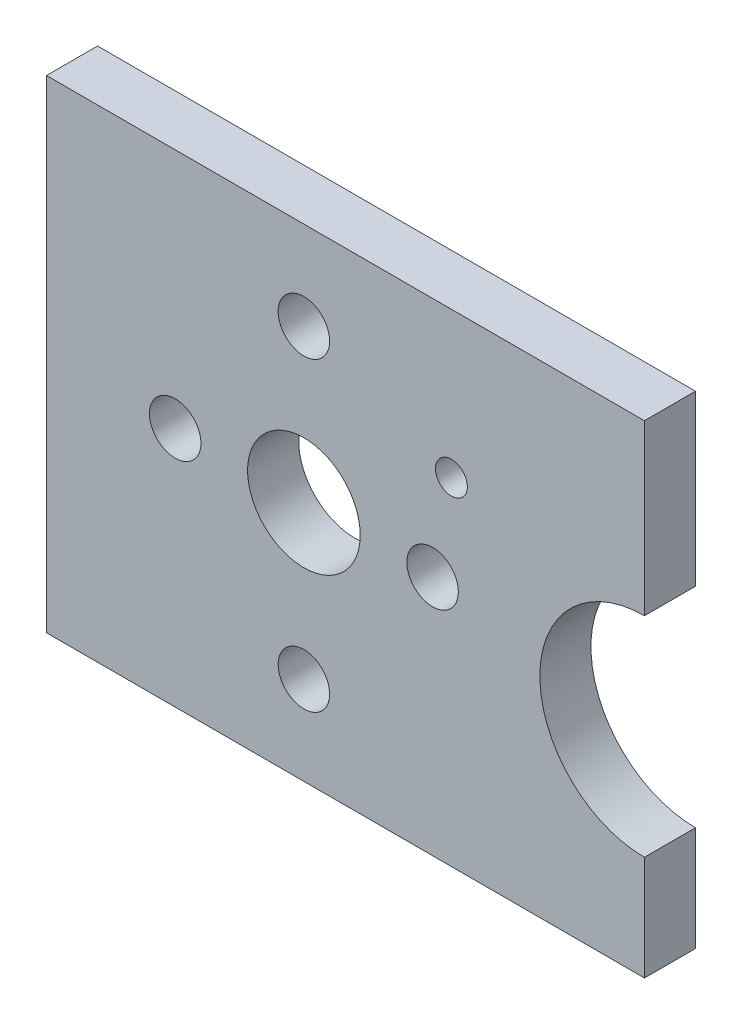
ISO-10303-21;
HEADER;
FILE_DESCRIPTION(('STEP AP214'),'2;1');
FILE_NAME('part.step','',(''),(''),'','','');
FILE_SCHEMA(('AUTOMOTIVE_DESIGN { 1 0 10303 214 1 1 1 1 }'));
ENDSEC;
DATA;
#1=APPLICATION_CONTEXT('core data for automotive mechanical design processes');
#2=APPLICATION_PROTOCOL_DEFINITION('international standard','automotive_design',2000,#1);
#3=PRODUCT_CONTEXT('',#1,'mechanical');
#4=PRODUCT('Part','Part','',(#3));
#5=PRODUCT_RELATED_PRODUCT_CATEGORY('part','',(#4));
#6=PRODUCT_DEFINITION_FORMATION('','',#4);
#7=PRODUCT_DEFINITION_CONTEXT('part definition',#1,'design');
#8=PRODUCT_DEFINITION('design','',#6,#7);
#9=PRODUCT_DEFINITION_SHAPE('','',#8);
#10=(LENGTH_UNIT() NAMED_UNIT(*) SI_UNIT(.MILLI.,.METRE.));
#11=(NAMED_UNIT(*) PLANE_ANGLE_UNIT() SI_UNIT($,.RADIAN.));
#12=(NAMED_UNIT(*) SI_UNIT($,.STERADIAN.) SOLID_ANGLE_UNIT());
#13=UNCERTAINTY_MEASURE_WITH_UNIT(LENGTH_MEASURE(1.E-05),#10,'distance_accuracy_value','');
#14=(GEOMETRIC_REPRESENTATION_CONTEXT(3) GLOBAL_UNCERTAINTY_ASSIGNED_CONTEXT((#13)) GLOBAL_UNIT_ASSIGNED_CONTEXT((#10,
#11,#12)) REPRESENTATION_CONTEXT('',''));
#15=CARTESIAN_POINT('',(0.,0.,0.));
#16=DIRECTION('',(0.,0.,1.));
#17=DIRECTION('',(1.,0.,0.));
#18=AXIS2_PLACEMENT_3D('',#15,#16,#17);
#19=CARTESIAN_POINT('',(37.1666992956996,13.,3.175));
#20=DIRECTION('',(0.,0.,1.));
#21=DIRECTION('',(1.,0.,0.));
#22=AXIS2_PLACEMENT_3D('',#19,#20,#21);
#23=PLANE('',#22);
#24=CARTESIAN_POINT('',(8.,15.,3.175));
#25=DIRECTION('',(0.,0.,1.));
#26=DIRECTION('',(-1.,0.,0.));
#27=AXIS2_PLACEMENT_3D('',#24,#25,#26);
#28=CIRCLE('',#27,1.6);
#29=CARTESIAN_POINT('',(6.4,15.,3.175));
#30=VERTEX_POINT('',#29);
#31=EDGE_CURVE('E200',#30,#30,#28,.T.);
#32=ORIENTED_EDGE('',*,*,#31,.F.);
#33=EDGE_LOOP('',(#32));
#34=FACE_BOUND('',#33,.T.);
#35=CARTESIAN_POINT('',(24.,15.,3.175));
#36=DIRECTION('',(0.,0.,1.));
#37=DIRECTION('',(1.,0.,0.));
#38=AXIS2_PLACEMENT_3D('',#35,#36,#37);
#39=CIRCLE('',#38,1.6);
#40=CARTESIAN_POINT('',(25.6,15.,3.175));
#41=VERTEX_POINT('',#40);
#42=EDGE_CURVE('E212',#41,#41,#39,.T.);
#43=ORIENTED_EDGE('',*,*,#42,.F.);
#44=EDGE_LOOP('',(#43));
#45=FACE_BOUND('',#44,.T.);
#46=CARTESIAN_POINT('',(25.1697789659621,20.9334001816327,3.175));
#47=DIRECTION('',(0.,0.,1.));
#48=DIRECTION('',(1.,0.,0.));
#49=AXIS2_PLACEMENT_3D('',#46,#47,#48);
#50=CIRCLE('',#49,0.990600000000001);
#51=CARTESIAN_POINT('',(26.1603789659621,20.9334001816327,3.175));
#52=VERTEX_POINT('',#51);
#53=EDGE_CURVE('E124',#52,#52,#50,.T.);
#54=ORIENTED_EDGE('',*,*,#53,.F.);
#55=EDGE_LOOP('',(#54));
#56=FACE_BOUND('',#55,.T.);
#57=DIRECTION('',(0.,-1.,0.));
#58=VECTOR('',#57,1.);
#59=CARTESIAN_POINT('',(0.,0.,3.175));
#60=LINE('',#59,#58);
#61=CARTESIAN_POINT('',(0.,30.,3.175));
#62=VERTEX_POINT('',#61);
#63=CARTESIAN_POINT('',(0.,0.,3.175));
#64=VERTEX_POINT('',#63);
#65=EDGE_CURVE('E131',#62,#64,#60,.T.);
#66=ORIENTED_EDGE('',*,*,#65,.T.);
#67=DIRECTION('',(1.,0.,0.));
#68=VECTOR('',#67,1.);
#69=CARTESIAN_POINT('',(0.,0.,3.175));
#70=LINE('',#69,#68);
#71=CARTESIAN_POINT('',(37.1666992956996,0.,3.175));
#72=VERTEX_POINT('',#71);
#73=EDGE_CURVE('E89',#64,#72,#70,.T.);
#74=ORIENTED_EDGE('',*,*,#73,.T.);
#75=DIRECTION('',(0.,1.,0.));
#76=VECTOR('',#75,1.);
#77=CARTESIAN_POINT('',(37.1666992956996,6.5,3.175));
#78=LINE('',#77,#76);
#79=CARTESIAN_POINT('',(37.1666992956996,6.5,3.175));
#80=VERTEX_POINT('',#79);
#81=EDGE_CURVE('E102',#72,#80,#78,.T.);
#82=ORIENTED_EDGE('',*,*,#81,.T.);
#83=CARTESIAN_POINT('',(37.1666992956996,13.,3.175));
#84=DIRECTION('',(0.,0.,-1.));
#85=DIRECTION('',(1.,0.,0.));
#86=AXIS2_PLACEMENT_3D('',#83,#84,#85);
#87=CIRCLE('',#86,6.5);
#88=CARTESIAN_POINT('',(37.1666992956996,19.5,3.175));
#89=VERTEX_POINT('',#88);
#90=EDGE_CURVE('E96',#80,#89,#87,.T.);
#91=ORIENTED_EDGE('',*,*,#90,.T.);
#92=DIRECTION('',(0.,1.,0.));
#93=VECTOR('',#92,1.);
#94=CARTESIAN_POINT('',(37.1666992956996,19.5,3.175));
#95=LINE('',#94,#93);
#96=CARTESIAN_POINT('',(37.1666992956996,30.,3.175));
#97=VERTEX_POINT('',#96);
#98=EDGE_CURVE('E100',#89,#97,#95,.T.);
#99=ORIENTED_EDGE('',*,*,#98,.T.);
#100=DIRECTION('',(-1.,0.,0.));
#101=VECTOR('',#100,1.);
#102=CARTESIAN_POINT('',(0.,30.,3.175));
#103=LINE('',#102,#101);
#104=EDGE_CURVE('E52',#97,#62,#103,.T.);
#105=ORIENTED_EDGE('',*,*,#104,.T.);
#106=EDGE_LOOP('',(#66,#74,#82,#91,#99,#105));
#107=FACE_BOUND('',#106,.T.);
#108=CARTESIAN_POINT('',(16.,24.5,3.175));
#109=DIRECTION('',(0.,0.,1.));
#110=DIRECTION('',(1.,0.,0.));
#111=AXIS2_PLACEMENT_3D('',#108,#109,#110);
#112=CIRCLE('',#111,1.6);
#113=CARTESIAN_POINT('',(17.6,24.5,3.175));
#114=VERTEX_POINT('',#113);
#115=EDGE_CURVE('E218',#114,#114,#112,.T.);
#116=ORIENTED_EDGE('',*,*,#115,.F.);
#117=EDGE_LOOP('',(#116));
#118=FACE_BOUND('',#117,.T.);
#119=CARTESIAN_POINT('',(16.,5.50000000000001,3.175));
#120=DIRECTION('',(0.,0.,1.));
#121=DIRECTION('',(-1.,0.,0.));
#122=AXIS2_PLACEMENT_3D('',#119,#120,#121);
#123=CIRCLE('',#122,1.6);
#124=CARTESIAN_POINT('',(14.4,5.50000000000001,3.175));
#125=VERTEX_POINT('',#124);
#126=EDGE_CURVE('E206',#125,#125,#123,.T.);
#127=ORIENTED_EDGE('',*,*,#126,.F.);
#128=EDGE_LOOP('',(#127));
#129=FACE_BOUND('',#128,.T.);
#130=CARTESIAN_POINT('',(16.,15.,3.175));
#131=DIRECTION('',(0.,0.,1.));
#132=DIRECTION('',(1.,0.,0.));
#133=AXIS2_PLACEMENT_3D('',#130,#131,#132);
#134=CIRCLE('',#133,3.5);
#135=CARTESIAN_POINT('',(19.5,15.,3.175));
#136=VERTEX_POINT('',#135);
#137=EDGE_CURVE('E191',#136,#136,#134,.T.);
#138=ORIENTED_EDGE('',*,*,#137,.F.);
#139=EDGE_LOOP('',(#138));
#140=FACE_BOUND('',#139,.T.);
#141=ADVANCED_FACE('F35',(#34,#45,#56,#107,#118,#129,#140),#23,.T.);
#142=CARTESIAN_POINT('',(37.1666992956996,13.,0.));
#143=DIRECTION('',(0.,0.,1.));
#144=DIRECTION('',(1.,0.,0.));
#145=AXIS2_PLACEMENT_3D('',#142,#143,#144);
#146=PLANE('',#145);
#147=CARTESIAN_POINT('',(8.,15.,0.));
#148=DIRECTION('',(0.,0.,1.));
#149=DIRECTION('',(-1.,0.,0.));
#150=AXIS2_PLACEMENT_3D('',#147,#148,#149);
#151=CIRCLE('',#150,1.6);
#152=CARTESIAN_POINT('',(6.4,15.,0.));
#153=VERTEX_POINT('',#152);
#154=EDGE_CURVE('E197',#153,#153,#151,.T.);
#155=ORIENTED_EDGE('',*,*,#154,.T.);
#156=EDGE_LOOP('',(#155));
#157=FACE_BOUND('',#156,.T.);
#158=CARTESIAN_POINT('',(24.,15.,0.));
#159=DIRECTION('',(0.,0.,1.));
#160=DIRECTION('',(1.,0.,0.));
#161=AXIS2_PLACEMENT_3D('',#158,#159,#160);
#162=CIRCLE('',#161,1.6);
#163=CARTESIAN_POINT('',(25.6,15.,0.));
#164=VERTEX_POINT('',#163);
#165=EDGE_CURVE('E209',#164,#164,#162,.T.);
#166=ORIENTED_EDGE('',*,*,#165,.T.);
#167=EDGE_LOOP('',(#166));
#168=FACE_BOUND('',#167,.T.);
#169=CARTESIAN_POINT('',(25.1697789659621,20.9334001816327,0.));
#170=DIRECTION('',(0.,0.,1.));
#171=DIRECTION('',(1.,0.,0.));
#172=AXIS2_PLACEMENT_3D('',#169,#170,#171);
#173=CIRCLE('',#172,0.990600000000001);
#174=CARTESIAN_POINT('',(26.1603789659621,20.9334001816327,0.));
#175=VERTEX_POINT('',#174);
#176=EDGE_CURVE('E221',#175,#175,#173,.T.);
#177=ORIENTED_EDGE('',*,*,#176,.T.);
#178=EDGE_LOOP('',(#177));
#179=FACE_BOUND('',#178,.T.);
#180=DIRECTION('',(0.,-1.,0.));
#181=VECTOR('',#180,1.);
#182=CARTESIAN_POINT('',(0.,0.,0.));
#183=LINE('',#182,#181);
#184=CARTESIAN_POINT('',(0.,30.,0.));
#185=VERTEX_POINT('',#184);
#186=CARTESIAN_POINT('',(0.,0.,0.));
#187=VERTEX_POINT('',#186);
#188=EDGE_CURVE('E120',#185,#187,#183,.T.);
#189=ORIENTED_EDGE('',*,*,#188,.F.);
#190=DIRECTION('',(-1.,0.,0.));
#191=VECTOR('',#190,1.);
#192=CARTESIAN_POINT('',(0.,30.,0.));
#193=LINE('',#192,#191);
#194=CARTESIAN_POINT('',(37.1666992956996,30.,0.));
#195=VERTEX_POINT('',#194);
#196=EDGE_CURVE('E81',#195,#185,#193,.T.);
#197=ORIENTED_EDGE('',*,*,#196,.F.);
#198=DIRECTION('',(0.,1.,0.));
#199=VECTOR('',#198,1.);
#200=CARTESIAN_POINT('',(37.1666992956996,19.5,0.));
#201=LINE('',#200,#199);
#202=CARTESIAN_POINT('',(37.1666992956996,19.5,0.));
#203=VERTEX_POINT('',#202);
#204=EDGE_CURVE('E75',#203,#195,#201,.T.);
#205=ORIENTED_EDGE('',*,*,#204,.F.);
#206=CARTESIAN_POINT('',(37.1666992956996,13.,0.));
#207=DIRECTION('',(0.,0.,-1.));
#208=DIRECTION('',(1.,0.,0.));
#209=AXIS2_PLACEMENT_3D('',#206,#207,#208);
#210=CIRCLE('',#209,6.5);
#211=CARTESIAN_POINT('',(37.1666992956996,6.5,0.));
#212=VERTEX_POINT('',#211);
#213=EDGE_CURVE('E110',#212,#203,#210,.T.);
#214=ORIENTED_EDGE('',*,*,#213,.F.);
#215=DIRECTION('',(0.,1.,0.));
#216=VECTOR('',#215,1.);
#217=CARTESIAN_POINT('',(37.1666992956996,6.5,0.));
#218=LINE('',#217,#216);
#219=CARTESIAN_POINT('',(37.1666992956996,0.,0.));
#220=VERTEX_POINT('',#219);
#221=EDGE_CURVE('E126',#220,#212,#218,.T.);
#222=ORIENTED_EDGE('',*,*,#221,.F.);
#223=DIRECTION('',(1.,0.,0.));
#224=VECTOR('',#223,1.);
#225=CARTESIAN_POINT('',(0.,0.,0.));
#226=LINE('',#225,#224);
#227=EDGE_CURVE('E123',#187,#220,#226,.T.);
#228=ORIENTED_EDGE('',*,*,#227,.F.);
#229=EDGE_LOOP('',(#189,#197,#205,#214,#222,#228));
#230=FACE_BOUND('',#229,.T.);
#231=CARTESIAN_POINT('',(16.,24.5,0.));
#232=DIRECTION('',(0.,0.,1.));
#233=DIRECTION('',(1.,0.,0.));
#234=AXIS2_PLACEMENT_3D('',#231,#232,#233);
#235=CIRCLE('',#234,1.6);
#236=CARTESIAN_POINT('',(17.6,24.5,0.));
#237=VERTEX_POINT('',#236);
#238=EDGE_CURVE('E215',#237,#237,#235,.T.);
#239=ORIENTED_EDGE('',*,*,#238,.T.);
#240=EDGE_LOOP('',(#239));
#241=FACE_BOUND('',#240,.T.);
#242=CARTESIAN_POINT('',(16.,5.50000000000001,0.));
#243=DIRECTION('',(0.,0.,1.));
#244=DIRECTION('',(-1.,0.,0.));
#245=AXIS2_PLACEMENT_3D('',#242,#243,#244);
#246=CIRCLE('',#245,1.6);
#247=CARTESIAN_POINT('',(14.4,5.50000000000001,0.));
#248=VERTEX_POINT('',#247);
#249=EDGE_CURVE('E203',#248,#248,#246,.T.);
#250=ORIENTED_EDGE('',*,*,#249,.T.);
#251=EDGE_LOOP('',(#250));
#252=FACE_BOUND('',#251,.T.);
#253=CARTESIAN_POINT('',(16.,15.,0.));
#254=DIRECTION('',(0.,0.,1.));
#255=DIRECTION('',(1.,0.,0.));
#256=AXIS2_PLACEMENT_3D('',#253,#254,#255);
#257=CIRCLE('',#256,3.5);
#258=CARTESIAN_POINT('',(19.5,15.,0.));
#259=VERTEX_POINT('',#258);
#260=EDGE_CURVE('E194',#259,#259,#257,.T.);
#261=ORIENTED_EDGE('',*,*,#260,.T.);
#262=EDGE_LOOP('',(#261));
#263=FACE_BOUND('',#262,.T.);
#264=ADVANCED_FACE('F140',(#157,#168,#179,#230,#241,#252,#263),#146,.F.);
#265=CARTESIAN_POINT('',(0.,0.,3.175));
#266=DIRECTION('',(1.,0.,0.));
#267=DIRECTION('',(0.,0.,-1.));
#268=AXIS2_PLACEMENT_3D('',#265,#266,#267);
#269=PLANE('',#268);
#270=ORIENTED_EDGE('',*,*,#188,.T.);
#271=DIRECTION('',(0.,0.,-1.));
#272=VECTOR('',#271,1.);
#273=CARTESIAN_POINT('',(0.,0.,3.175));
#274=LINE('',#273,#272);
#275=EDGE_CURVE('E11',#64,#187,#274,.T.);
#276=ORIENTED_EDGE('',*,*,#275,.F.);
#277=ORIENTED_EDGE('',*,*,#65,.F.);
#278=DIRECTION('',(0.,0.,-1.));
#279=VECTOR('',#278,1.);
#280=CARTESIAN_POINT('',(0.,30.,3.175));
#281=LINE('',#280,#279);
#282=EDGE_CURVE('E116',#62,#185,#281,.T.);
#283=ORIENTED_EDGE('',*,*,#282,.T.);
#284=EDGE_LOOP('',(#270,#276,#277,#283));
#285=FACE_BOUND('',#284,.T.);
#286=ADVANCED_FACE('F37',(#285),#269,.F.);
#287=CARTESIAN_POINT('',(0.,0.,3.175));
#288=DIRECTION('',(0.,1.,0.));
#289=DIRECTION('',(0.,0.,1.));
#290=AXIS2_PLACEMENT_3D('',#287,#288,#289);
#291=PLANE('',#290);
#292=ORIENTED_EDGE('',*,*,#227,.T.);
#293=DIRECTION('',(0.,0.,-1.));
#294=VECTOR('',#293,1.);
#295=CARTESIAN_POINT('',(37.1666992956996,0.,3.175));
#296=LINE('',#295,#294);
#297=EDGE_CURVE('E44',#72,#220,#296,.T.);
#298=ORIENTED_EDGE('',*,*,#297,.F.);
#299=ORIENTED_EDGE('',*,*,#73,.F.);
#300=ORIENTED_EDGE('',*,*,#275,.T.);
#301=EDGE_LOOP('',(#292,#298,#299,#300));
#302=FACE_BOUND('',#301,.T.);
#303=ADVANCED_FACE('F296',(#302),#291,.F.);
#304=CARTESIAN_POINT('',(37.1666992956996,6.5,3.175));
#305=DIRECTION('',(-1.,0.,0.));
#306=DIRECTION('',(0.,-1.,0.));
#307=AXIS2_PLACEMENT_3D('',#304,#305,#306);
#308=PLANE('',#307);
#309=ORIENTED_EDGE('',*,*,#221,.T.);
#310=DIRECTION('',(0.,0.,-1.));
#311=VECTOR('',#310,1.);
#312=CARTESIAN_POINT('',(37.1666992956996,6.5,3.175));
#313=LINE('',#312,#311);
#314=EDGE_CURVE('E111',#80,#212,#313,.T.);
#315=ORIENTED_EDGE('',*,*,#314,.F.);
#316=ORIENTED_EDGE('',*,*,#81,.F.);
#317=ORIENTED_EDGE('',*,*,#297,.T.);
#318=EDGE_LOOP('',(#309,#315,#316,#317));
#319=FACE_BOUND('',#318,.T.);
#320=ADVANCED_FACE('F137',(#319),#308,.F.);
#321=CARTESIAN_POINT('',(37.1666992956996,13.,3.175));
#322=DIRECTION('',(0.,0.,-1.));
#323=DIRECTION('',(-1.,0.,0.));
#324=AXIS2_PLACEMENT_3D('',#321,#322,#323);
#325=CYLINDRICAL_SURFACE('',#324,6.5);
#326=ORIENTED_EDGE('',*,*,#213,.T.);
#327=DIRECTION('',(0.,0.,-1.));
#328=VECTOR('',#327,1.);
#329=CARTESIAN_POINT('',(37.1666992956996,19.5,3.175));
#330=LINE('',#329,#328);
#331=EDGE_CURVE('E107',#89,#203,#330,.T.);
#332=ORIENTED_EDGE('',*,*,#331,.F.);
#333=ORIENTED_EDGE('',*,*,#90,.F.);
#334=ORIENTED_EDGE('',*,*,#314,.T.);
#335=EDGE_LOOP('',(#326,#332,#333,#334));
#336=FACE_BOUND('',#335,.T.);
#337=ADVANCED_FACE('F108',(#336),#325,.F.);
#338=CARTESIAN_POINT('',(37.1666992956996,19.5,3.175));
#339=DIRECTION('',(-1.,0.,0.));
#340=DIRECTION('',(0.,-1.,0.));
#341=AXIS2_PLACEMENT_3D('',#338,#339,#340);
#342=PLANE('',#341);
#343=ORIENTED_EDGE('',*,*,#204,.T.);
#344=DIRECTION('',(0.,0.,-1.));
#345=VECTOR('',#344,1.);
#346=CARTESIAN_POINT('',(37.1666992956996,30.,3.175));
#347=LINE('',#346,#345);
#348=EDGE_CURVE('E112',#97,#195,#347,.T.);
#349=ORIENTED_EDGE('',*,*,#348,.F.);
#350=ORIENTED_EDGE('',*,*,#98,.F.);
#351=ORIENTED_EDGE('',*,*,#331,.T.);
#352=EDGE_LOOP('',(#343,#349,#350,#351));
#353=FACE_BOUND('',#352,.T.);
#354=ADVANCED_FACE('F114',(#353),#342,.F.);
#355=CARTESIAN_POINT('',(0.,30.,3.175));
#356=DIRECTION('',(0.,-1.,0.));
#357=DIRECTION('',(0.,0.,-1.));
#358=AXIS2_PLACEMENT_3D('',#355,#356,#357);
#359=PLANE('',#358);
#360=ORIENTED_EDGE('',*,*,#196,.T.);
#361=ORIENTED_EDGE('',*,*,#282,.F.);
#362=ORIENTED_EDGE('',*,*,#104,.F.);
#363=ORIENTED_EDGE('',*,*,#348,.T.);
#364=EDGE_LOOP('',(#360,#361,#362,#363));
#365=FACE_BOUND('',#364,.T.);
#366=ADVANCED_FACE('F145',(#365),#359,.F.);
#367=CARTESIAN_POINT('',(25.1697789659621,20.9334001816327,3.175));
#368=DIRECTION('',(0.,0.,-1.));
#369=DIRECTION('',(-1.,0.,0.));
#370=AXIS2_PLACEMENT_3D('',#367,#368,#369);
#371=CYLINDRICAL_SURFACE('',#370,0.990600000000001);
#372=ORIENTED_EDGE('',*,*,#53,.T.);
#373=EDGE_LOOP('',(#372));
#374=FACE_BOUND('',#373,.T.);
#375=ORIENTED_EDGE('',*,*,#176,.F.);
#376=EDGE_LOOP('',(#375));
#377=FACE_BOUND('',#376,.T.);
#378=ADVANCED_FACE('F147',(#374,#377),#371,.F.);
#379=CARTESIAN_POINT('',(16.,24.5,3.175));
#380=DIRECTION('',(0.,0.,-1.));
#381=DIRECTION('',(-1.,0.,0.));
#382=AXIS2_PLACEMENT_3D('',#379,#380,#381);
#383=CYLINDRICAL_SURFACE('',#382,1.6);
#384=ORIENTED_EDGE('',*,*,#115,.T.);
#385=EDGE_LOOP('',(#384));
#386=FACE_BOUND('',#385,.T.);
#387=ORIENTED_EDGE('',*,*,#238,.F.);
#388=EDGE_LOOP('',(#387));
#389=FACE_BOUND('',#388,.T.);
#390=ADVANCED_FACE('F153',(#386,#389),#383,.F.);
#391=CARTESIAN_POINT('',(24.,15.,3.175));
#392=DIRECTION('',(0.,0.,-1.));
#393=DIRECTION('',(-1.,0.,0.));
#394=AXIS2_PLACEMENT_3D('',#391,#392,#393);
#395=CYLINDRICAL_SURFACE('',#394,1.6);
#396=ORIENTED_EDGE('',*,*,#42,.T.);
#397=EDGE_LOOP('',(#396));
#398=FACE_BOUND('',#397,.T.);
#399=ORIENTED_EDGE('',*,*,#165,.F.);
#400=EDGE_LOOP('',(#399));
#401=FACE_BOUND('',#400,.T.);
#402=ADVANCED_FACE('F170',(#398,#401),#395,.F.);
#403=CARTESIAN_POINT('',(16.,5.50000000000001,3.175));
#404=DIRECTION('',(0.,0.,-1.));
#405=DIRECTION('',(-1.,0.,0.));
#406=AXIS2_PLACEMENT_3D('',#403,#404,#405);
#407=CYLINDRICAL_SURFACE('',#406,1.6);
#408=ORIENTED_EDGE('',*,*,#126,.T.);
#409=EDGE_LOOP('',(#408));
#410=FACE_BOUND('',#409,.T.);
#411=ORIENTED_EDGE('',*,*,#249,.F.);
#412=EDGE_LOOP('',(#411));
#413=FACE_BOUND('',#412,.T.);
#414=ADVANCED_FACE('F174',(#410,#413),#407,.F.);
#415=CARTESIAN_POINT('',(8.,15.,3.175));
#416=DIRECTION('',(0.,0.,-1.));
#417=DIRECTION('',(-1.,0.,0.));
#418=AXIS2_PLACEMENT_3D('',#415,#416,#417);
#419=CYLINDRICAL_SURFACE('',#418,1.6);
#420=ORIENTED_EDGE('',*,*,#31,.T.);
#421=EDGE_LOOP('',(#420));
#422=FACE_BOUND('',#421,.T.);
#423=ORIENTED_EDGE('',*,*,#154,.F.);
#424=EDGE_LOOP('',(#423));
#425=FACE_BOUND('',#424,.T.);
#426=ADVANCED_FACE('F178',(#422,#425),#419,.F.);
#427=CARTESIAN_POINT('',(16.,15.,3.175));
#428=DIRECTION('',(0.,0.,-1.));
#429=DIRECTION('',(-1.,0.,0.));
#430=AXIS2_PLACEMENT_3D('',#427,#428,#429);
#431=CYLINDRICAL_SURFACE('',#430,3.5);
#432=ORIENTED_EDGE('',*,*,#137,.T.);
#433=EDGE_LOOP('',(#432));
#434=FACE_BOUND('',#433,.T.);
#435=ORIENTED_EDGE('',*,*,#260,.F.);
#436=EDGE_LOOP('',(#435));
#437=FACE_BOUND('',#436,.T.);
#438=ADVANCED_FACE('F182',(#434,#437),#431,.F.);
#439=CLOSED_SHELL('',(#141,#264,#286,#303,#320,#337,#354,#366,#378,#390,#402,#414,#426,#438));
#440=MANIFOLD_SOLID_BREP('B2',#439);
#441=ADVANCED_BREP_SHAPE_REPRESENTATION('',(#18,#440),#14);
#442=SHAPE_DEFINITION_REPRESENTATION(#9,#441);
ENDSEC;
END-ISO-10303-21;
